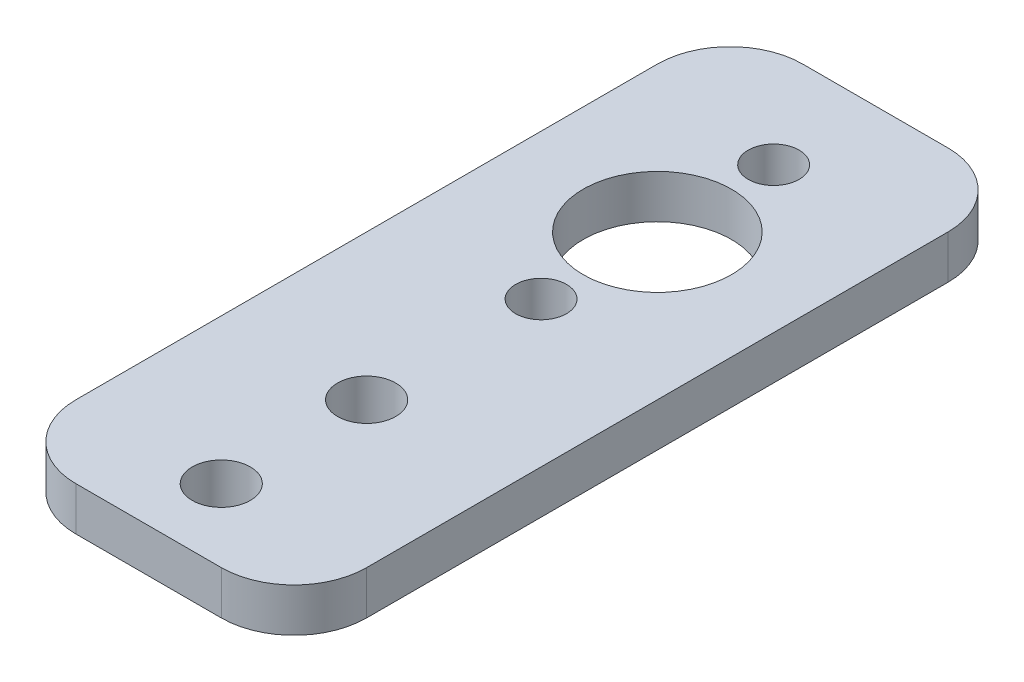
ISO-10303-21;
HEADER;
FILE_DESCRIPTION(('STEP AP214'),'2;1');
FILE_NAME('part.step','',(''),(''),'','','');
FILE_SCHEMA(('AUTOMOTIVE_DESIGN { 1 0 10303 214 1 1 1 1 }'));
ENDSEC;
DATA;
#1=APPLICATION_CONTEXT('core data for automotive mechanical design processes');
#2=APPLICATION_PROTOCOL_DEFINITION('international standard','automotive_design',2000,#1);
#3=PRODUCT_CONTEXT('',#1,'mechanical');
#4=PRODUCT('Part','Part','',(#3));
#5=PRODUCT_RELATED_PRODUCT_CATEGORY('part','',(#4));
#6=PRODUCT_DEFINITION_FORMATION('','',#4);
#7=PRODUCT_DEFINITION_CONTEXT('part definition',#1,'design');
#8=PRODUCT_DEFINITION('design','',#6,#7);
#9=PRODUCT_DEFINITION_SHAPE('','',#8);
#10=(LENGTH_UNIT() NAMED_UNIT(*) SI_UNIT(.MILLI.,.METRE.));
#11=(NAMED_UNIT(*) PLANE_ANGLE_UNIT() SI_UNIT($,.RADIAN.));
#12=(NAMED_UNIT(*) SI_UNIT($,.STERADIAN.) SOLID_ANGLE_UNIT());
#13=UNCERTAINTY_MEASURE_WITH_UNIT(LENGTH_MEASURE(1.E-05),#10,'distance_accuracy_value','');
#14=(GEOMETRIC_REPRESENTATION_CONTEXT(3) GLOBAL_UNCERTAINTY_ASSIGNED_CONTEXT((#13)) GLOBAL_UNIT_ASSIGNED_CONTEXT((#10,
#11,#12)) REPRESENTATION_CONTEXT('',''));
#15=CARTESIAN_POINT('',(0.,0.,0.));
#16=DIRECTION('',(0.,0.,1.));
#17=DIRECTION('',(1.,0.,0.));
#18=AXIS2_PLACEMENT_3D('',#15,#16,#17);
#19=CARTESIAN_POINT('',(10.,3.,-25.));
#20=DIRECTION('',(-1.,0.,0.));
#21=DIRECTION('',(0.,0.,1.));
#22=AXIS2_PLACEMENT_3D('',#19,#20,#21);
#23=PLANE('',#22);
#24=DIRECTION('',(0.,0.,-1.));
#25=VECTOR('',#24,1.);
#26=CARTESIAN_POINT('',(10.,3.,-25.));
#27=LINE('',#26,#25);
#28=CARTESIAN_POINT('',(10.,3.,20.));
#29=VERTEX_POINT('',#28);
#30=CARTESIAN_POINT('',(10.,3.,-20.));
#31=VERTEX_POINT('',#30);
#32=EDGE_CURVE('E117',#29,#31,#27,.T.);
#33=ORIENTED_EDGE('',*,*,#32,.F.);
#34=DIRECTION('',(0.,-1.,0.));
#35=VECTOR('',#34,1.);
#36=CARTESIAN_POINT('',(10.,3.,20.));
#37=LINE('',#36,#35);
#38=CARTESIAN_POINT('',(10.,0.,20.));
#39=VERTEX_POINT('',#38);
#40=EDGE_CURVE('E102',#29,#39,#37,.T.);
#41=ORIENTED_EDGE('',*,*,#40,.T.);
#42=DIRECTION('',(0.,0.,-1.));
#43=VECTOR('',#42,1.);
#44=CARTESIAN_POINT('',(10.,0.,-25.));
#45=LINE('',#44,#43);
#46=CARTESIAN_POINT('',(10.,0.,-20.));
#47=VERTEX_POINT('',#46);
#48=EDGE_CURVE('E114',#39,#47,#45,.T.);
#49=ORIENTED_EDGE('',*,*,#48,.T.);
#50=DIRECTION('',(0.,-1.,0.));
#51=VECTOR('',#50,1.);
#52=CARTESIAN_POINT('',(10.,3.,-20.));
#53=LINE('',#52,#51);
#54=EDGE_CURVE('E119',#47,#31,#53,.F.);
#55=ORIENTED_EDGE('',*,*,#54,.T.);
#56=EDGE_LOOP('',(#33,#41,#49,#55));
#57=FACE_BOUND('',#56,.T.);
#58=ADVANCED_FACE('F32',(#57),#23,.F.);
#59=CARTESIAN_POINT('',(-10.,3.,-25.));
#60=DIRECTION('',(0.,0.,1.));
#61=DIRECTION('',(1.,0.,0.));
#62=AXIS2_PLACEMENT_3D('',#59,#60,#61);
#63=PLANE('',#62);
#64=DIRECTION('',(-1.,0.,0.));
#65=VECTOR('',#64,1.);
#66=CARTESIAN_POINT('',(-10.,0.,-25.));
#67=LINE('',#66,#65);
#68=CARTESIAN_POINT('',(5.,0.,-25.));
#69=VERTEX_POINT('',#68);
#70=CARTESIAN_POINT('',(-5.,0.,-25.));
#71=VERTEX_POINT('',#70);
#72=EDGE_CURVE('E123',#69,#71,#67,.T.);
#73=ORIENTED_EDGE('',*,*,#72,.T.);
#74=DIRECTION('',(0.,-1.,0.));
#75=VECTOR('',#74,1.);
#76=CARTESIAN_POINT('',(-5.,3.,-25.));
#77=LINE('',#76,#75);
#78=CARTESIAN_POINT('',(-5.,3.,-25.));
#79=VERTEX_POINT('',#78);
#80=EDGE_CURVE('E11',#71,#79,#77,.F.);
#81=ORIENTED_EDGE('',*,*,#80,.T.);
#82=DIRECTION('',(-1.,0.,0.));
#83=VECTOR('',#82,1.);
#84=CARTESIAN_POINT('',(-10.,3.,-25.));
#85=LINE('',#84,#83);
#86=CARTESIAN_POINT('',(5.,3.,-25.));
#87=VERTEX_POINT('',#86);
#88=EDGE_CURVE('E163',#87,#79,#85,.T.);
#89=ORIENTED_EDGE('',*,*,#88,.F.);
#90=DIRECTION('',(0.,-1.,0.));
#91=VECTOR('',#90,1.);
#92=CARTESIAN_POINT('',(5.,3.,-25.));
#93=LINE('',#92,#91);
#94=EDGE_CURVE('E40',#87,#69,#93,.T.);
#95=ORIENTED_EDGE('',*,*,#94,.T.);
#96=EDGE_LOOP('',(#73,#81,#89,#95));
#97=FACE_BOUND('',#96,.T.);
#98=ADVANCED_FACE('F161',(#97),#63,.F.);
#99=CARTESIAN_POINT('',(-10.,3.,-25.));
#100=DIRECTION('',(1.,0.,0.));
#101=DIRECTION('',(0.,0.,-1.));
#102=AXIS2_PLACEMENT_3D('',#99,#100,#101);
#103=PLANE('',#102);
#104=DIRECTION('',(0.,0.,1.));
#105=VECTOR('',#104,1.);
#106=CARTESIAN_POINT('',(-10.,0.,-25.));
#107=LINE('',#106,#105);
#108=CARTESIAN_POINT('',(-10.,0.,-20.));
#109=VERTEX_POINT('',#108);
#110=CARTESIAN_POINT('',(-9.99999999999999,0.,20.));
#111=VERTEX_POINT('',#110);
#112=EDGE_CURVE('E127',#109,#111,#107,.T.);
#113=ORIENTED_EDGE('',*,*,#112,.T.);
#114=DIRECTION('',(0.,-1.,0.));
#115=VECTOR('',#114,1.);
#116=CARTESIAN_POINT('',(-9.99999999999999,3.,20.));
#117=LINE('',#116,#115);
#118=CARTESIAN_POINT('',(-9.99999999999999,3.,20.));
#119=VERTEX_POINT('',#118);
#120=EDGE_CURVE('E47',#111,#119,#117,.F.);
#121=ORIENTED_EDGE('',*,*,#120,.T.);
#122=DIRECTION('',(0.,0.,1.));
#123=VECTOR('',#122,1.);
#124=CARTESIAN_POINT('',(-10.,3.,-25.));
#125=LINE('',#124,#123);
#126=CARTESIAN_POINT('',(-10.,3.,-20.));
#127=VERTEX_POINT('',#126);
#128=EDGE_CURVE('E171',#127,#119,#125,.T.);
#129=ORIENTED_EDGE('',*,*,#128,.F.);
#130=DIRECTION('',(0.,-1.,0.));
#131=VECTOR('',#130,1.);
#132=CARTESIAN_POINT('',(-10.,3.,-20.));
#133=LINE('',#132,#131);
#134=EDGE_CURVE('E154',#127,#109,#133,.T.);
#135=ORIENTED_EDGE('',*,*,#134,.T.);
#136=EDGE_LOOP('',(#113,#121,#129,#135));
#137=FACE_BOUND('',#136,.T.);
#138=ADVANCED_FACE('F170',(#137),#103,.F.);
#139=CARTESIAN_POINT('',(-9.99999999999999,3.,25.));
#140=DIRECTION('',(0.,0.,-1.));
#141=DIRECTION('',(-1.,0.,0.));
#142=AXIS2_PLACEMENT_3D('',#139,#140,#141);
#143=PLANE('',#142);
#144=DIRECTION('',(1.,0.,0.));
#145=VECTOR('',#144,1.);
#146=CARTESIAN_POINT('',(-9.99999999999999,0.,25.));
#147=LINE('',#146,#145);
#148=CARTESIAN_POINT('',(-4.99999999999999,0.,25.));
#149=VERTEX_POINT('',#148);
#150=CARTESIAN_POINT('',(5.00000000000001,0.,25.));
#151=VERTEX_POINT('',#150);
#152=EDGE_CURVE('E137',#149,#151,#147,.T.);
#153=ORIENTED_EDGE('',*,*,#152,.T.);
#154=DIRECTION('',(0.,-1.,0.));
#155=VECTOR('',#154,1.);
#156=CARTESIAN_POINT('',(5.00000000000001,3.,25.));
#157=LINE('',#156,#155);
#158=CARTESIAN_POINT('',(5.00000000000001,3.,25.));
#159=VERTEX_POINT('',#158);
#160=EDGE_CURVE('E103',#151,#159,#157,.F.);
#161=ORIENTED_EDGE('',*,*,#160,.T.);
#162=DIRECTION('',(1.,0.,0.));
#163=VECTOR('',#162,1.);
#164=CARTESIAN_POINT('',(-9.99999999999999,3.,25.));
#165=LINE('',#164,#163);
#166=CARTESIAN_POINT('',(-4.99999999999999,3.,25.));
#167=VERTEX_POINT('',#166);
#168=EDGE_CURVE('E133',#167,#159,#165,.T.);
#169=ORIENTED_EDGE('',*,*,#168,.F.);
#170=DIRECTION('',(0.,-1.,0.));
#171=VECTOR('',#170,1.);
#172=CARTESIAN_POINT('',(-4.99999999999999,3.,25.));
#173=LINE('',#172,#171);
#174=EDGE_CURVE('E108',#167,#149,#173,.T.);
#175=ORIENTED_EDGE('',*,*,#174,.T.);
#176=EDGE_LOOP('',(#153,#161,#169,#175));
#177=FACE_BOUND('',#176,.T.);
#178=ADVANCED_FACE('F217',(#177),#143,.F.);
#179=CARTESIAN_POINT('',(0.,3.,0.));
#180=DIRECTION('',(0.,1.,0.));
#181=DIRECTION('',(0.,0.,1.));
#182=AXIS2_PLACEMENT_3D('',#179,#180,#181);
#183=PLANE('',#182);
#184=CARTESIAN_POINT('',(0.,3.,20.));
#185=DIRECTION('',(0.,1.,0.));
#186=DIRECTION('',(0.,0.,1.));
#187=AXIS2_PLACEMENT_3D('',#184,#185,#186);
#188=CIRCLE('',#187,2.);
#189=CARTESIAN_POINT('',(0.,3.,22.));
#190=VERTEX_POINT('',#189);
#191=EDGE_CURVE('E187',#190,#190,#188,.T.);
#192=ORIENTED_EDGE('',*,*,#191,.F.);
#193=EDGE_LOOP('',(#192));
#194=FACE_BOUND('',#193,.T.);
#195=CARTESIAN_POINT('',(0.,3.,-10.));
#196=DIRECTION('',(0.,1.,0.));
#197=DIRECTION('',(0.,0.,1.));
#198=AXIS2_PLACEMENT_3D('',#195,#196,#197);
#199=CIRCLE('',#198,5.1);
#200=CARTESIAN_POINT('',(0.,3.,-4.9));
#201=VERTEX_POINT('',#200);
#202=EDGE_CURVE('E180',#201,#201,#199,.T.);
#203=ORIENTED_EDGE('',*,*,#202,.F.);
#204=EDGE_LOOP('',(#203));
#205=FACE_BOUND('',#204,.T.);
#206=CARTESIAN_POINT('',(0.,3.,-18.));
#207=DIRECTION('',(0.,1.,0.));
#208=DIRECTION('',(0.,0.,1.));
#209=AXIS2_PLACEMENT_3D('',#206,#207,#208);
#210=CIRCLE('',#209,1.75);
#211=CARTESIAN_POINT('',(0.,3.,-16.25));
#212=VERTEX_POINT('',#211);
#213=EDGE_CURVE('E198',#212,#212,#210,.T.);
#214=ORIENTED_EDGE('',*,*,#213,.F.);
#215=EDGE_LOOP('',(#214));
#216=FACE_BOUND('',#215,.T.);
#217=CARTESIAN_POINT('',(0.,3.,-2.));
#218=DIRECTION('',(0.,1.,0.));
#219=DIRECTION('',(0.,0.,1.));
#220=AXIS2_PLACEMENT_3D('',#217,#218,#219);
#221=CIRCLE('',#220,1.75);
#222=CARTESIAN_POINT('',(0.,3.,-0.249999999999999));
#223=VERTEX_POINT('',#222);
#224=EDGE_CURVE('E192',#223,#223,#221,.T.);
#225=ORIENTED_EDGE('',*,*,#224,.F.);
#226=EDGE_LOOP('',(#225));
#227=FACE_BOUND('',#226,.T.);
#228=CARTESIAN_POINT('',(0.,3.,10.));
#229=DIRECTION('',(0.,1.,0.));
#230=DIRECTION('',(0.,0.,1.));
#231=AXIS2_PLACEMENT_3D('',#228,#229,#230);
#232=CIRCLE('',#231,2.);
#233=CARTESIAN_POINT('',(0.,3.,12.));
#234=VERTEX_POINT('',#233);
#235=EDGE_CURVE('E130',#234,#234,#232,.T.);
#236=ORIENTED_EDGE('',*,*,#235,.F.);
#237=EDGE_LOOP('',(#236));
#238=FACE_BOUND('',#237,.T.);
#239=ORIENTED_EDGE('',*,*,#168,.T.);
#240=CARTESIAN_POINT('',(5.00000000000001,3.,20.));
#241=DIRECTION('',(0.,1.,0.));
#242=DIRECTION('',(0.,0.,1.));
#243=AXIS2_PLACEMENT_3D('',#240,#241,#242);
#244=CIRCLE('',#243,5.);
#245=EDGE_CURVE('E152',#159,#29,#244,.T.);
#246=ORIENTED_EDGE('',*,*,#245,.T.);
#247=ORIENTED_EDGE('',*,*,#32,.T.);
#248=CARTESIAN_POINT('',(5.,3.,-20.));
#249=DIRECTION('',(0.,1.,0.));
#250=DIRECTION('',(0.,0.,1.));
#251=AXIS2_PLACEMENT_3D('',#248,#249,#250);
#252=CIRCLE('',#251,5.);
#253=EDGE_CURVE('E147',#31,#87,#252,.T.);
#254=ORIENTED_EDGE('',*,*,#253,.T.);
#255=ORIENTED_EDGE('',*,*,#88,.T.);
#256=CARTESIAN_POINT('',(-5.,3.,-20.));
#257=DIRECTION('',(0.,1.,0.));
#258=DIRECTION('',(0.,0.,1.));
#259=AXIS2_PLACEMENT_3D('',#256,#257,#258);
#260=CIRCLE('',#259,5.);
#261=EDGE_CURVE('E54',#79,#127,#260,.T.);
#262=ORIENTED_EDGE('',*,*,#261,.T.);
#263=ORIENTED_EDGE('',*,*,#128,.T.);
#264=CARTESIAN_POINT('',(-4.99999999999999,3.,20.));
#265=DIRECTION('',(0.,1.,0.));
#266=DIRECTION('',(0.,0.,1.));
#267=AXIS2_PLACEMENT_3D('',#264,#265,#266);
#268=CIRCLE('',#267,5.);
#269=EDGE_CURVE('E150',#119,#167,#268,.T.);
#270=ORIENTED_EDGE('',*,*,#269,.T.);
#271=EDGE_LOOP('',(#239,#246,#247,#254,#255,#262,#263,#270));
#272=FACE_BOUND('',#271,.T.);
#273=ADVANCED_FACE('F214',(#194,#205,#216,#227,#238,#272),#183,.T.);
#274=CARTESIAN_POINT('',(0.,0.,0.));
#275=DIRECTION('',(0.,1.,0.));
#276=DIRECTION('',(0.,0.,1.));
#277=AXIS2_PLACEMENT_3D('',#274,#275,#276);
#278=PLANE('',#277);
#279=CARTESIAN_POINT('',(0.,0.,20.));
#280=DIRECTION('',(0.,1.,0.));
#281=DIRECTION('',(0.,0.,1.));
#282=AXIS2_PLACEMENT_3D('',#279,#280,#281);
#283=CIRCLE('',#282,2.);
#284=CARTESIAN_POINT('',(0.,0.,22.));
#285=VERTEX_POINT('',#284);
#286=EDGE_CURVE('E178',#285,#285,#283,.T.);
#287=ORIENTED_EDGE('',*,*,#286,.T.);
#288=EDGE_LOOP('',(#287));
#289=FACE_BOUND('',#288,.T.);
#290=CARTESIAN_POINT('',(0.,0.,-10.));
#291=DIRECTION('',(0.,1.,0.));
#292=DIRECTION('',(0.,0.,1.));
#293=AXIS2_PLACEMENT_3D('',#290,#291,#292);
#294=CIRCLE('',#293,5.1);
#295=CARTESIAN_POINT('',(0.,0.,-4.9));
#296=VERTEX_POINT('',#295);
#297=EDGE_CURVE('E183',#296,#296,#294,.T.);
#298=ORIENTED_EDGE('',*,*,#297,.T.);
#299=EDGE_LOOP('',(#298));
#300=FACE_BOUND('',#299,.T.);
#301=CARTESIAN_POINT('',(0.,0.,-18.));
#302=DIRECTION('',(0.,1.,0.));
#303=DIRECTION('',(0.,0.,1.));
#304=AXIS2_PLACEMENT_3D('',#301,#302,#303);
#305=CIRCLE('',#304,1.75);
#306=CARTESIAN_POINT('',(0.,0.,-16.25));
#307=VERTEX_POINT('',#306);
#308=EDGE_CURVE('E184',#307,#307,#305,.T.);
#309=ORIENTED_EDGE('',*,*,#308,.T.);
#310=EDGE_LOOP('',(#309));
#311=FACE_BOUND('',#310,.T.);
#312=CARTESIAN_POINT('',(0.,0.,-2.));
#313=DIRECTION('',(0.,1.,0.));
#314=DIRECTION('',(0.,0.,1.));
#315=AXIS2_PLACEMENT_3D('',#312,#313,#314);
#316=CIRCLE('',#315,1.75);
#317=CARTESIAN_POINT('',(0.,0.,-0.249999999999999));
#318=VERTEX_POINT('',#317);
#319=EDGE_CURVE('E195',#318,#318,#316,.T.);
#320=ORIENTED_EDGE('',*,*,#319,.T.);
#321=EDGE_LOOP('',(#320));
#322=FACE_BOUND('',#321,.T.);
#323=CARTESIAN_POINT('',(0.,0.,10.));
#324=DIRECTION('',(0.,1.,0.));
#325=DIRECTION('',(0.,0.,1.));
#326=AXIS2_PLACEMENT_3D('',#323,#324,#325);
#327=CIRCLE('',#326,2.);
#328=CARTESIAN_POINT('',(0.,0.,12.));
#329=VERTEX_POINT('',#328);
#330=EDGE_CURVE('E124',#329,#329,#327,.T.);
#331=ORIENTED_EDGE('',*,*,#330,.T.);
#332=EDGE_LOOP('',(#331));
#333=FACE_BOUND('',#332,.T.);
#334=ORIENTED_EDGE('',*,*,#48,.F.);
#335=CARTESIAN_POINT('',(5.00000000000001,0.,20.));
#336=DIRECTION('',(0.,1.,0.));
#337=DIRECTION('',(0.,0.,1.));
#338=AXIS2_PLACEMENT_3D('',#335,#336,#337);
#339=CIRCLE('',#338,5.);
#340=EDGE_CURVE('E98',#39,#151,#339,.F.);
#341=ORIENTED_EDGE('',*,*,#340,.T.);
#342=ORIENTED_EDGE('',*,*,#152,.F.);
#343=CARTESIAN_POINT('',(-4.99999999999999,0.,20.));
#344=DIRECTION('',(0.,1.,0.));
#345=DIRECTION('',(0.,0.,1.));
#346=AXIS2_PLACEMENT_3D('',#343,#344,#345);
#347=CIRCLE('',#346,5.);
#348=EDGE_CURVE('E109',#149,#111,#347,.F.);
#349=ORIENTED_EDGE('',*,*,#348,.T.);
#350=ORIENTED_EDGE('',*,*,#112,.F.);
#351=CARTESIAN_POINT('',(-5.,0.,-20.));
#352=DIRECTION('',(0.,1.,0.));
#353=DIRECTION('',(0.,0.,1.));
#354=AXIS2_PLACEMENT_3D('',#351,#352,#353);
#355=CIRCLE('',#354,5.);
#356=EDGE_CURVE('E141',#109,#71,#355,.F.);
#357=ORIENTED_EDGE('',*,*,#356,.T.);
#358=ORIENTED_EDGE('',*,*,#72,.F.);
#359=CARTESIAN_POINT('',(5.,0.,-20.));
#360=DIRECTION('',(0.,1.,0.));
#361=DIRECTION('',(0.,0.,1.));
#362=AXIS2_PLACEMENT_3D('',#359,#360,#361);
#363=CIRCLE('',#362,5.);
#364=EDGE_CURVE('E118',#69,#47,#363,.F.);
#365=ORIENTED_EDGE('',*,*,#364,.T.);
#366=EDGE_LOOP('',(#334,#341,#342,#349,#350,#357,#358,#365));
#367=FACE_BOUND('',#366,.T.);
#368=ADVANCED_FACE('F121',(#289,#300,#311,#322,#333,#367),#278,.F.);
#369=CARTESIAN_POINT('',(0.,0.,10.));
#370=DIRECTION('',(0.,1.,0.));
#371=DIRECTION('',(0.,0.,1.));
#372=AXIS2_PLACEMENT_3D('',#369,#370,#371);
#373=CYLINDRICAL_SURFACE('',#372,2.);
#374=ORIENTED_EDGE('',*,*,#330,.F.);
#375=EDGE_LOOP('',(#374));
#376=FACE_BOUND('',#375,.T.);
#377=ORIENTED_EDGE('',*,*,#235,.T.);
#378=EDGE_LOOP('',(#377));
#379=FACE_BOUND('',#378,.T.);
#380=ADVANCED_FACE('F248',(#376,#379),#373,.F.);
#381=CARTESIAN_POINT('',(0.,0.,-2.));
#382=DIRECTION('',(0.,1.,0.));
#383=DIRECTION('',(0.,0.,1.));
#384=AXIS2_PLACEMENT_3D('',#381,#382,#383);
#385=CYLINDRICAL_SURFACE('',#384,1.75);
#386=ORIENTED_EDGE('',*,*,#319,.F.);
#387=EDGE_LOOP('',(#386));
#388=FACE_BOUND('',#387,.T.);
#389=ORIENTED_EDGE('',*,*,#224,.T.);
#390=EDGE_LOOP('',(#389));
#391=FACE_BOUND('',#390,.T.);
#392=ADVANCED_FACE('F210',(#388,#391),#385,.F.);
#393=CARTESIAN_POINT('',(0.,0.,-18.));
#394=DIRECTION('',(0.,1.,0.));
#395=DIRECTION('',(0.,0.,1.));
#396=AXIS2_PLACEMENT_3D('',#393,#394,#395);
#397=CYLINDRICAL_SURFACE('',#396,1.75);
#398=ORIENTED_EDGE('',*,*,#308,.F.);
#399=EDGE_LOOP('',(#398));
#400=FACE_BOUND('',#399,.T.);
#401=ORIENTED_EDGE('',*,*,#213,.T.);
#402=EDGE_LOOP('',(#401));
#403=FACE_BOUND('',#402,.T.);
#404=ADVANCED_FACE('F206',(#400,#403),#397,.F.);
#405=CARTESIAN_POINT('',(0.,0.,-10.));
#406=DIRECTION('',(0.,1.,0.));
#407=DIRECTION('',(0.,0.,1.));
#408=AXIS2_PLACEMENT_3D('',#405,#406,#407);
#409=CYLINDRICAL_SURFACE('',#408,5.1);
#410=ORIENTED_EDGE('',*,*,#297,.F.);
#411=EDGE_LOOP('',(#410));
#412=FACE_BOUND('',#411,.T.);
#413=ORIENTED_EDGE('',*,*,#202,.T.);
#414=EDGE_LOOP('',(#413));
#415=FACE_BOUND('',#414,.T.);
#416=ADVANCED_FACE('F209',(#412,#415),#409,.F.);
#417=CARTESIAN_POINT('',(0.,0.,20.));
#418=DIRECTION('',(0.,1.,0.));
#419=DIRECTION('',(0.,0.,1.));
#420=AXIS2_PLACEMENT_3D('',#417,#418,#419);
#421=CYLINDRICAL_SURFACE('',#420,2.);
#422=ORIENTED_EDGE('',*,*,#286,.F.);
#423=EDGE_LOOP('',(#422));
#424=FACE_BOUND('',#423,.T.);
#425=ORIENTED_EDGE('',*,*,#191,.T.);
#426=EDGE_LOOP('',(#425));
#427=FACE_BOUND('',#426,.T.);
#428=ADVANCED_FACE('F234',(#424,#427),#421,.F.);
#429=CARTESIAN_POINT('',(5.00000000000001,3.,20.));
#430=DIRECTION('',(0.,-1.,0.));
#431=DIRECTION('',(0.,0.,-1.));
#432=AXIS2_PLACEMENT_3D('',#429,#430,#431);
#433=CYLINDRICAL_SURFACE('',#432,5.);
#434=ORIENTED_EDGE('',*,*,#245,.F.);
#435=ORIENTED_EDGE('',*,*,#160,.F.);
#436=ORIENTED_EDGE('',*,*,#340,.F.);
#437=ORIENTED_EDGE('',*,*,#40,.F.);
#438=EDGE_LOOP('',(#434,#435,#436,#437));
#439=FACE_BOUND('',#438,.T.);
#440=ADVANCED_FACE('F101',(#439),#433,.T.);
#441=CARTESIAN_POINT('',(-4.99999999999999,3.,20.));
#442=DIRECTION('',(0.,-1.,0.));
#443=DIRECTION('',(0.,0.,-1.));
#444=AXIS2_PLACEMENT_3D('',#441,#442,#443);
#445=CYLINDRICAL_SURFACE('',#444,5.);
#446=ORIENTED_EDGE('',*,*,#269,.F.);
#447=ORIENTED_EDGE('',*,*,#120,.F.);
#448=ORIENTED_EDGE('',*,*,#348,.F.);
#449=ORIENTED_EDGE('',*,*,#174,.F.);
#450=EDGE_LOOP('',(#446,#447,#448,#449));
#451=FACE_BOUND('',#450,.T.);
#452=ADVANCED_FACE('F227',(#451),#445,.T.);
#453=CARTESIAN_POINT('',(-5.,3.,-20.));
#454=DIRECTION('',(0.,-1.,0.));
#455=DIRECTION('',(0.,0.,-1.));
#456=AXIS2_PLACEMENT_3D('',#453,#454,#455);
#457=CYLINDRICAL_SURFACE('',#456,5.);
#458=ORIENTED_EDGE('',*,*,#261,.F.);
#459=ORIENTED_EDGE('',*,*,#80,.F.);
#460=ORIENTED_EDGE('',*,*,#356,.F.);
#461=ORIENTED_EDGE('',*,*,#134,.F.);
#462=EDGE_LOOP('',(#458,#459,#460,#461));
#463=FACE_BOUND('',#462,.T.);
#464=ADVANCED_FACE('F169',(#463),#457,.T.);
#465=CARTESIAN_POINT('',(5.,3.,-20.));
#466=DIRECTION('',(0.,-1.,0.));
#467=DIRECTION('',(0.,0.,-1.));
#468=AXIS2_PLACEMENT_3D('',#465,#466,#467);
#469=CYLINDRICAL_SURFACE('',#468,5.);
#470=ORIENTED_EDGE('',*,*,#253,.F.);
#471=ORIENTED_EDGE('',*,*,#54,.F.);
#472=ORIENTED_EDGE('',*,*,#364,.F.);
#473=ORIENTED_EDGE('',*,*,#94,.F.);
#474=EDGE_LOOP('',(#470,#471,#472,#473));
#475=FACE_BOUND('',#474,.T.);
#476=ADVANCED_FACE('F34',(#475),#469,.T.);
#477=CLOSED_SHELL('',(#58,#98,#138,#178,#273,#368,#380,#392,#404,#416,#428,#440,#452,#464,#476));
#478=MANIFOLD_SOLID_BREP('B2',#477);
#479=ADVANCED_BREP_SHAPE_REPRESENTATION('',(#18,#478),#14);
#480=SHAPE_DEFINITION_REPRESENTATION(#9,#479);
ENDSEC;
END-ISO-10303-21;
